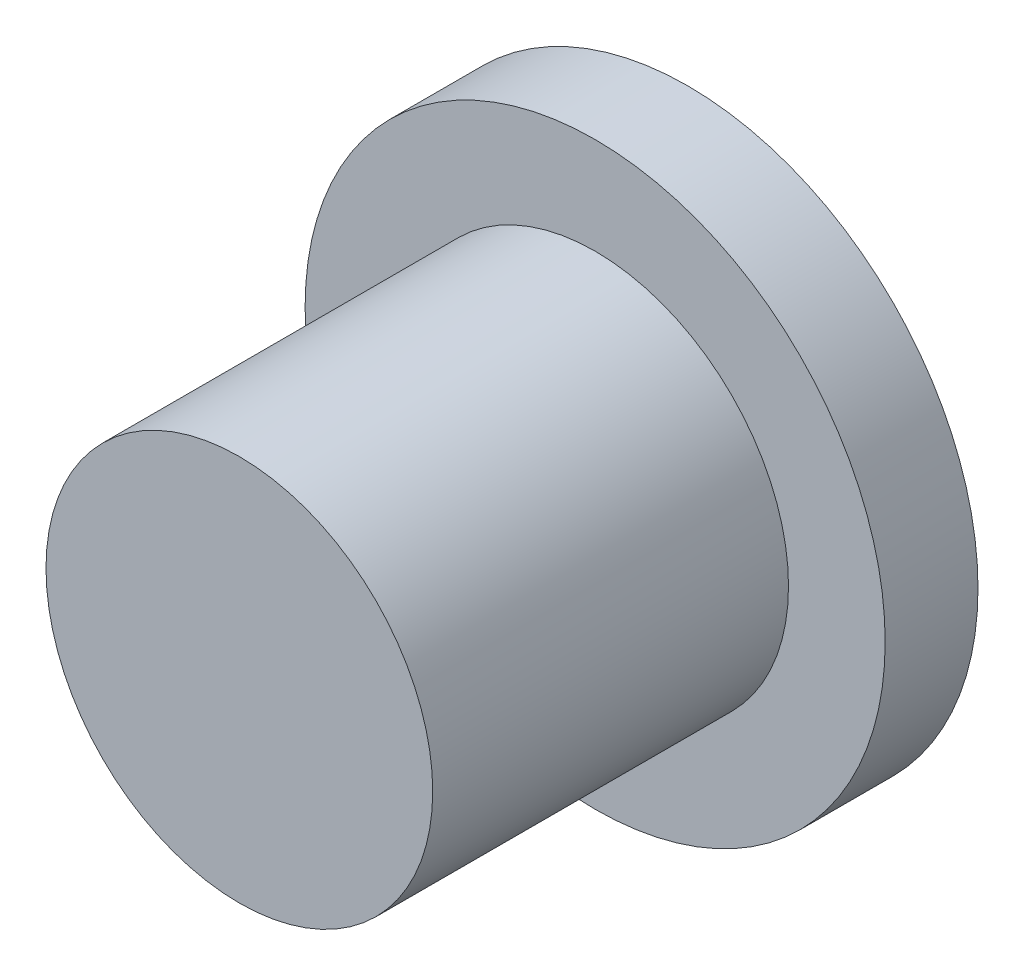
ISO-10303-21;
HEADER;
FILE_DESCRIPTION(('STEP AP214'),'2;1');
FILE_NAME('part.step','',(''),(''),'','','');
FILE_SCHEMA(('AUTOMOTIVE_DESIGN { 1 0 10303 214 1 1 1 1 }'));
ENDSEC;
DATA;
#1=APPLICATION_CONTEXT('core data for automotive mechanical design processes');
#2=APPLICATION_PROTOCOL_DEFINITION('international standard','automotive_design',2000,#1);
#3=PRODUCT_CONTEXT('',#1,'mechanical');
#4=PRODUCT('Part','Part','',(#3));
#5=PRODUCT_RELATED_PRODUCT_CATEGORY('part','',(#4));
#6=PRODUCT_DEFINITION_FORMATION('','',#4);
#7=PRODUCT_DEFINITION_CONTEXT('part definition',#1,'design');
#8=PRODUCT_DEFINITION('design','',#6,#7);
#9=PRODUCT_DEFINITION_SHAPE('','',#8);
#10=(LENGTH_UNIT() NAMED_UNIT(*) SI_UNIT(.MILLI.,.METRE.));
#11=(NAMED_UNIT(*) PLANE_ANGLE_UNIT() SI_UNIT($,.RADIAN.));
#12=(NAMED_UNIT(*) SI_UNIT($,.STERADIAN.) SOLID_ANGLE_UNIT());
#13=UNCERTAINTY_MEASURE_WITH_UNIT(LENGTH_MEASURE(1.E-05),#10,'distance_accuracy_value','');
#14=(GEOMETRIC_REPRESENTATION_CONTEXT(3) GLOBAL_UNCERTAINTY_ASSIGNED_CONTEXT((#13)) GLOBAL_UNIT_ASSIGNED_CONTEXT((#10,
#11,#12)) REPRESENTATION_CONTEXT('',''));
#15=CARTESIAN_POINT('',(0.,0.,0.));
#16=DIRECTION('',(0.,0.,1.));
#17=DIRECTION('',(1.,0.,0.));
#18=AXIS2_PLACEMENT_3D('',#15,#16,#17);
#19=CARTESIAN_POINT('',(0.,0.,5.8));
#20=DIRECTION('',(0.,0.,-1.));
#21=DIRECTION('',(-1.,0.,0.));
#22=AXIS2_PLACEMENT_3D('',#19,#20,#21);
#23=CYLINDRICAL_SURFACE('',#22,2.5);
#24=CARTESIAN_POINT('',(0.,0.,1.2));
#25=DIRECTION('',(0.,0.,1.));
#26=DIRECTION('',(1.,0.,0.));
#27=AXIS2_PLACEMENT_3D('',#24,#25,#26);
#28=CIRCLE('',#27,2.5);
#29=CARTESIAN_POINT('',(2.5,0.,1.2));
#30=VERTEX_POINT('',#29);
#31=EDGE_CURVE('E37',#30,#30,#28,.T.);
#32=ORIENTED_EDGE('',*,*,#31,.T.);
#33=EDGE_LOOP('',(#32));
#34=FACE_BOUND('',#33,.T.);
#35=CARTESIAN_POINT('',(0.,0.,5.8));
#36=DIRECTION('',(0.,0.,1.));
#37=DIRECTION('',(1.,0.,0.));
#38=AXIS2_PLACEMENT_3D('',#35,#36,#37);
#39=CIRCLE('',#38,2.5);
#40=CARTESIAN_POINT('',(2.5,0.,5.8));
#41=VERTEX_POINT('',#40);
#42=EDGE_CURVE('E10',#41,#41,#39,.T.);
#43=ORIENTED_EDGE('',*,*,#42,.F.);
#44=EDGE_LOOP('',(#43));
#45=FACE_BOUND('',#44,.T.);
#46=ADVANCED_FACE('F40',(#34,#45),#23,.T.);
#47=CARTESIAN_POINT('',(0.,0.,5.8));
#48=DIRECTION('',(0.,0.,1.));
#49=DIRECTION('',(1.,0.,0.));
#50=AXIS2_PLACEMENT_3D('',#47,#48,#49);
#51=PLANE('',#50);
#52=ORIENTED_EDGE('',*,*,#42,.T.);
#53=EDGE_LOOP('',(#52));
#54=FACE_BOUND('',#53,.T.);
#55=ADVANCED_FACE('F58',(#54),#51,.T.);
#56=CARTESIAN_POINT('',(0.,0.,1.2));
#57=DIRECTION('',(0.,0.,-1.));
#58=DIRECTION('',(-1.,0.,0.));
#59=AXIS2_PLACEMENT_3D('',#56,#57,#58);
#60=CYLINDRICAL_SURFACE('',#59,3.75);
#61=CARTESIAN_POINT('',(0.,0.,1.2));
#62=DIRECTION('',(0.,0.,1.));
#63=DIRECTION('',(1.,0.,0.));
#64=AXIS2_PLACEMENT_3D('',#61,#62,#63);
#65=CIRCLE('',#64,3.75);
#66=CARTESIAN_POINT('',(3.75,0.,1.2));
#67=VERTEX_POINT('',#66);
#68=EDGE_CURVE('E50',#67,#67,#65,.T.);
#69=ORIENTED_EDGE('',*,*,#68,.F.);
#70=EDGE_LOOP('',(#69));
#71=FACE_BOUND('',#70,.T.);
#72=CARTESIAN_POINT('',(0.,0.,0.));
#73=DIRECTION('',(0.,0.,1.));
#74=DIRECTION('',(1.,0.,0.));
#75=AXIS2_PLACEMENT_3D('',#72,#73,#74);
#76=CIRCLE('',#75,3.75);
#77=CARTESIAN_POINT('',(3.75,0.,0.));
#78=VERTEX_POINT('',#77);
#79=EDGE_CURVE('E47',#78,#78,#76,.T.);
#80=ORIENTED_EDGE('',*,*,#79,.T.);
#81=EDGE_LOOP('',(#80));
#82=FACE_BOUND('',#81,.T.);
#83=ADVANCED_FACE('F60',(#71,#82),#60,.T.);
#84=CARTESIAN_POINT('',(0.,0.,1.2));
#85=DIRECTION('',(0.,0.,1.));
#86=DIRECTION('',(1.,0.,0.));
#87=AXIS2_PLACEMENT_3D('',#84,#85,#86);
#88=PLANE('',#87);
#89=ORIENTED_EDGE('',*,*,#31,.F.);
#90=EDGE_LOOP('',(#89));
#91=FACE_BOUND('',#90,.T.);
#92=ORIENTED_EDGE('',*,*,#68,.T.);
#93=EDGE_LOOP('',(#92));
#94=FACE_BOUND('',#93,.T.);
#95=ADVANCED_FACE('F54',(#91,#94),#88,.T.);
#96=CARTESIAN_POINT('',(0.,0.,0.));
#97=DIRECTION('',(0.,0.,1.));
#98=DIRECTION('',(1.,0.,0.));
#99=AXIS2_PLACEMENT_3D('',#96,#97,#98);
#100=PLANE('',#99);
#101=ORIENTED_EDGE('',*,*,#79,.F.);
#102=EDGE_LOOP('',(#101));
#103=FACE_BOUND('',#102,.T.);
#104=ADVANCED_FACE('F65',(#103),#100,.F.);
#105=CLOSED_SHELL('',(#46,#55,#83,#95,#104));
#106=MANIFOLD_SOLID_BREP('B2',#105);
#107=ADVANCED_BREP_SHAPE_REPRESENTATION('',(#18,#106),#14);
#108=SHAPE_DEFINITION_REPRESENTATION(#9,#107);
ENDSEC;
END-ISO-10303-21;
